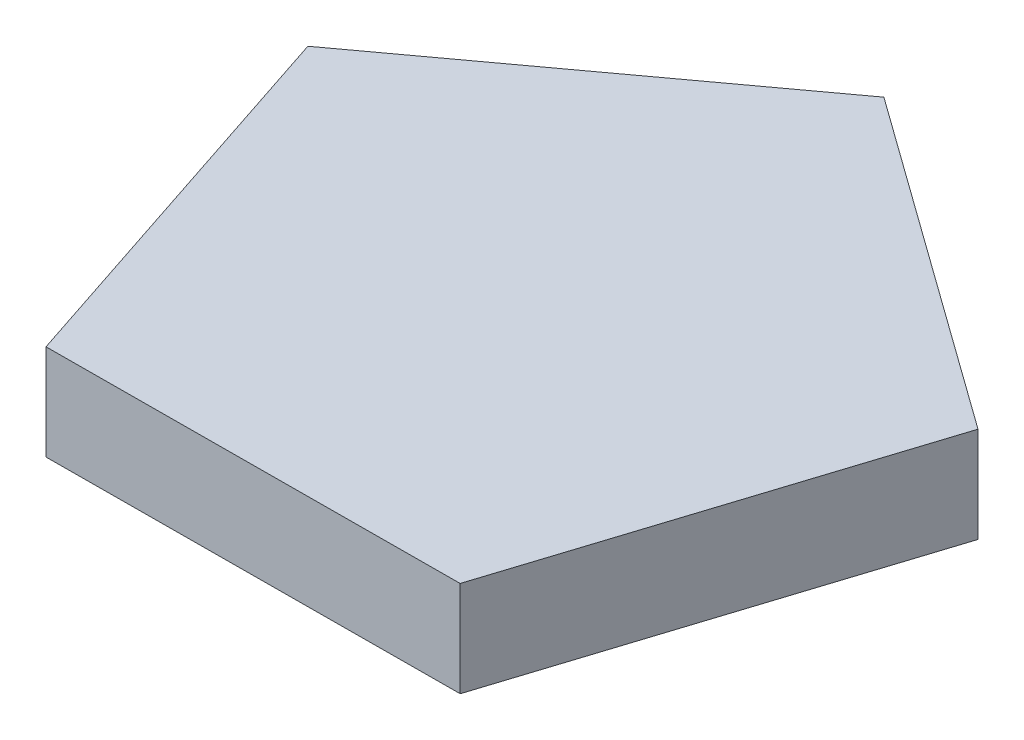
ISO-10303-21;
HEADER;
FILE_DESCRIPTION(('STEP AP214'),'2;1');
FILE_NAME('part.step','',(''),(''),'','','');
FILE_SCHEMA(('AUTOMOTIVE_DESIGN { 1 0 10303 214 1 1 1 1 }'));
ENDSEC;
DATA;
#1=APPLICATION_CONTEXT('core data for automotive mechanical design processes');
#2=APPLICATION_PROTOCOL_DEFINITION('international standard','automotive_design',2000,#1);
#3=PRODUCT_CONTEXT('',#1,'mechanical');
#4=PRODUCT('Part','Part','',(#3));
#5=PRODUCT_RELATED_PRODUCT_CATEGORY('part','',(#4));
#6=PRODUCT_DEFINITION_FORMATION('','',#4);
#7=PRODUCT_DEFINITION_CONTEXT('part definition',#1,'design');
#8=PRODUCT_DEFINITION('design','',#6,#7);
#9=PRODUCT_DEFINITION_SHAPE('','',#8);
#10=(LENGTH_UNIT() NAMED_UNIT(*) SI_UNIT(.MILLI.,.METRE.));
#11=(NAMED_UNIT(*) PLANE_ANGLE_UNIT() SI_UNIT($,.RADIAN.));
#12=(NAMED_UNIT(*) SI_UNIT($,.STERADIAN.) SOLID_ANGLE_UNIT());
#13=UNCERTAINTY_MEASURE_WITH_UNIT(LENGTH_MEASURE(1.E-05),#10,'distance_accuracy_value','');
#14=(GEOMETRIC_REPRESENTATION_CONTEXT(3) GLOBAL_UNCERTAINTY_ASSIGNED_CONTEXT((#13)) GLOBAL_UNIT_ASSIGNED_CONTEXT((#10,
#11,#12)) REPRESENTATION_CONTEXT('',''));
#15=CARTESIAN_POINT('',(0.,0.,0.));
#16=DIRECTION('',(0.,0.,1.));
#17=DIRECTION('',(1.,0.,0.));
#18=AXIS2_PLACEMENT_3D('',#15,#16,#17);
#19=CARTESIAN_POINT('',(-39.9534683706474,10.,14.2552900290625));
#20=DIRECTION('',(-0.00516467531645516,0.,-0.9999866629755));
#21=DIRECTION('',(-0.9999866629755,0.,0.00516467531645516));
#22=AXIS2_PLACEMENT_3D('',#19,#20,#21);
#23=PLANE('',#22);
#24=DIRECTION('',(0.9999866629755,0.,-0.00516467531645516));
#25=VECTOR('',#24,1.);
#26=CARTESIAN_POINT('',(-39.9534683706474,0.,14.2552900290625));
#27=LINE('',#26,#25);
#28=CARTESIAN_POINT('',(-39.9534683706474,0.,14.2552900290625));
#29=VERTEX_POINT('',#28);
#30=CARTESIAN_POINT('',(3.17402861006254,0.,14.0325475392237));
#31=VERTEX_POINT('',#30);
#32=EDGE_CURVE('E122',#29,#31,#27,.T.);
#33=ORIENTED_EDGE('',*,*,#32,.T.);
#34=DIRECTION('',(0.,-1.,0.));
#35=VECTOR('',#34,1.);
#36=CARTESIAN_POINT('',(3.17402861006254,10.,14.0325475392237));
#37=LINE('',#36,#35);
#38=CARTESIAN_POINT('',(3.17402861006254,10.,14.0325475392237));
#39=VERTEX_POINT('',#38);
#40=EDGE_CURVE('E11',#39,#31,#37,.T.);
#41=ORIENTED_EDGE('',*,*,#40,.F.);
#42=DIRECTION('',(0.9999866629755,0.,-0.00516467531645516));
#43=VECTOR('',#42,1.);
#44=CARTESIAN_POINT('',(-39.9534683706474,10.,14.2552900290625));
#45=LINE('',#44,#43);
#46=CARTESIAN_POINT('',(-39.9534683706474,10.,14.2552900290625));
#47=VERTEX_POINT('',#46);
#48=EDGE_CURVE('E135',#47,#39,#45,.T.);
#49=ORIENTED_EDGE('',*,*,#48,.F.);
#50=DIRECTION('',(0.,-1.,0.));
#51=VECTOR('',#50,1.);
#52=CARTESIAN_POINT('',(-39.9534683706474,10.,14.2552900290625));
#53=LINE('',#52,#51);
#54=EDGE_CURVE('E118',#47,#29,#53,.T.);
#55=ORIENTED_EDGE('',*,*,#54,.T.);
#56=EDGE_LOOP('',(#33,#41,#49,#55));
#57=FACE_BOUND('',#56,.T.);
#58=ADVANCED_FACE('F43',(#57),#23,.F.);
#59=CARTESIAN_POINT('',(3.17402861006254,10.,14.0325475392237));
#60=DIRECTION('',(-0.952639804474308,0.,-0.304100974893459));
#61=DIRECTION('',(-0.304100974893459,0.,0.952639804474308));
#62=AXIS2_PLACEMENT_3D('',#59,#60,#61);
#63=PLANE('',#62);
#64=DIRECTION('',(0.304100974893459,0.,-0.952639804474308));
#65=VECTOR('',#64,1.);
#66=CARTESIAN_POINT('',(3.17402861006254,0.,14.0325475392237));
#67=LINE('',#66,#65);
#68=CARTESIAN_POINT('',(16.2893174055392,0.,-27.0529707105096));
#69=VERTEX_POINT('',#68);
#70=EDGE_CURVE('E126',#31,#69,#67,.T.);
#71=ORIENTED_EDGE('',*,*,#70,.T.);
#72=DIRECTION('',(0.,-1.,0.));
#73=VECTOR('',#72,1.);
#74=CARTESIAN_POINT('',(16.2893174055392,10.,-27.0529707105096));
#75=LINE('',#74,#73);
#76=CARTESIAN_POINT('',(16.2893174055392,10.,-27.0529707105096));
#77=VERTEX_POINT('',#76);
#78=EDGE_CURVE('E52',#77,#69,#75,.T.);
#79=ORIENTED_EDGE('',*,*,#78,.F.);
#80=DIRECTION('',(0.304100974893459,0.,-0.952639804474308));
#81=VECTOR('',#80,1.);
#82=CARTESIAN_POINT('',(3.17402861006254,10.,14.0325475392237));
#83=LINE('',#82,#81);
#84=EDGE_CURVE('E94',#39,#77,#83,.T.);
#85=ORIENTED_EDGE('',*,*,#84,.F.);
#86=ORIENTED_EDGE('',*,*,#40,.T.);
#87=EDGE_LOOP('',(#71,#79,#85,#86));
#88=FACE_BOUND('',#87,.T.);
#89=ADVANCED_FACE('F157',(#88),#63,.F.);
#90=CARTESIAN_POINT('',(16.2893174055392,10.,-27.0529707105096));
#91=DIRECTION('',(-0.583599102884721,0.,0.812041924479364));
#92=DIRECTION('',(0.812041924479364,0.,0.583599102884721));
#93=AXIS2_PLACEMENT_3D('',#90,#91,#92);
#94=PLANE('',#93);
#95=DIRECTION('',(-0.812041924479364,0.,-0.583599102884721));
#96=VECTOR('',#95,1.);
#97=CARTESIAN_POINT('',(16.2893174055392,0.,-27.0529707105096));
#98=LINE('',#97,#96);
#99=CARTESIAN_POINT('',(-18.7324853272956,0.,-52.2224749444102));
#100=VERTEX_POINT('',#99);
#101=EDGE_CURVE('E110',#69,#100,#98,.T.);
#102=ORIENTED_EDGE('',*,*,#101,.T.);
#103=DIRECTION('',(0.,-1.,0.));
#104=VECTOR('',#103,1.);
#105=CARTESIAN_POINT('',(-18.7324853272956,10.,-52.2224749444102));
#106=LINE('',#105,#104);
#107=CARTESIAN_POINT('',(-18.7324853272956,10.,-52.2224749444102));
#108=VERTEX_POINT('',#107);
#109=EDGE_CURVE('E107',#108,#100,#106,.T.);
#110=ORIENTED_EDGE('',*,*,#109,.F.);
#111=DIRECTION('',(-0.812041924479364,0.,-0.583599102884721));
#112=VECTOR('',#111,1.);
#113=CARTESIAN_POINT('',(16.2893174055392,10.,-27.0529707105096));
#114=LINE('',#113,#112);
#115=EDGE_CURVE('E98',#77,#108,#114,.T.);
#116=ORIENTED_EDGE('',*,*,#115,.F.);
#117=ORIENTED_EDGE('',*,*,#78,.T.);
#118=EDGE_LOOP('',(#102,#110,#116,#117));
#119=FACE_BOUND('',#118,.T.);
#120=ADVANCED_FACE('F108',(#119),#94,.F.);
#121=CARTESIAN_POINT('',(-18.7324853272956,10.,-52.2224749444102));
#122=DIRECTION('',(0.591955723087603,0.,0.805970484511581));
#123=DIRECTION('',(0.805970484511581,0.,-0.591955723087603));
#124=AXIS2_PLACEMENT_3D('',#121,#122,#123);
#125=PLANE('',#124);
#126=DIRECTION('',(-0.805970484511581,0.,0.591955723087603));
#127=VECTOR('',#126,1.);
#128=CARTESIAN_POINT('',(-18.7324853272956,0.,-52.2224749444102));
#129=LINE('',#128,#127);
#130=CARTESIAN_POINT('',(-53.4924385589581,0.,-26.6925657912117));
#131=VERTEX_POINT('',#130);
#132=EDGE_CURVE('E80',#100,#131,#129,.T.);
#133=ORIENTED_EDGE('',*,*,#132,.T.);
#134=DIRECTION('',(0.,-1.,0.));
#135=VECTOR('',#134,1.);
#136=CARTESIAN_POINT('',(-53.4924385589581,10.,-26.6925657912117));
#137=LINE('',#136,#135);
#138=CARTESIAN_POINT('',(-53.4924385589581,10.,-26.6925657912117));
#139=VERTEX_POINT('',#138);
#140=EDGE_CURVE('E112',#139,#131,#137,.T.);
#141=ORIENTED_EDGE('',*,*,#140,.F.);
#142=DIRECTION('',(-0.805970484511581,0.,0.591955723087603));
#143=VECTOR('',#142,1.);
#144=CARTESIAN_POINT('',(-18.7324853272956,10.,-52.2224749444102));
#145=LINE('',#144,#143);
#146=EDGE_CURVE('E102',#108,#139,#145,.T.);
#147=ORIENTED_EDGE('',*,*,#146,.F.);
#148=ORIENTED_EDGE('',*,*,#109,.T.);
#149=EDGE_LOOP('',(#133,#141,#147,#148));
#150=FACE_BOUND('',#149,.T.);
#151=ADVANCED_FACE('F114',(#150),#125,.F.);
#152=CARTESIAN_POINT('',(-53.4924385589581,10.,-26.6925657912117));
#153=DIRECTION('',(0.949447859587881,0.,-0.313924771121986));
#154=DIRECTION('',(-0.313924771121986,0.,-0.949447859587881));
#155=AXIS2_PLACEMENT_3D('',#152,#153,#154);
#156=PLANE('',#155);
#157=DIRECTION('',(0.313924771121986,0.,0.949447859587881));
#158=VECTOR('',#157,1.);
#159=CARTESIAN_POINT('',(-53.4924385589581,0.,-26.6925657912117));
#160=LINE('',#159,#158);
#161=EDGE_CURVE('E86',#131,#29,#160,.T.);
#162=ORIENTED_EDGE('',*,*,#161,.T.);
#163=ORIENTED_EDGE('',*,*,#54,.F.);
#164=DIRECTION('',(0.313924771121986,0.,0.949447859587881));
#165=VECTOR('',#164,1.);
#166=CARTESIAN_POINT('',(-53.4924385589581,10.,-26.6925657912117));
#167=LINE('',#166,#165);
#168=EDGE_CURVE('E60',#139,#47,#167,.T.);
#169=ORIENTED_EDGE('',*,*,#168,.F.);
#170=ORIENTED_EDGE('',*,*,#140,.T.);
#171=EDGE_LOOP('',(#162,#163,#169,#170));
#172=FACE_BOUND('',#171,.T.);
#173=ADVANCED_FACE('F146',(#172),#156,.F.);
#174=CARTESIAN_POINT('',(0.,10.,0.));
#175=DIRECTION('',(0.,1.,0.));
#176=DIRECTION('',(0.,0.,1.));
#177=AXIS2_PLACEMENT_3D('',#174,#175,#176);
#178=PLANE('',#177);
#179=ORIENTED_EDGE('',*,*,#48,.T.);
#180=ORIENTED_EDGE('',*,*,#84,.T.);
#181=ORIENTED_EDGE('',*,*,#115,.T.);
#182=ORIENTED_EDGE('',*,*,#146,.T.);
#183=ORIENTED_EDGE('',*,*,#168,.T.);
#184=EDGE_LOOP('',(#179,#180,#181,#182,#183));
#185=FACE_BOUND('',#184,.T.);
#186=ADVANCED_FACE('F100',(#185),#178,.T.);
#187=CARTESIAN_POINT('',(0.,0.,0.));
#188=DIRECTION('',(0.,1.,0.));
#189=DIRECTION('',(0.,0.,1.));
#190=AXIS2_PLACEMENT_3D('',#187,#188,#189);
#191=PLANE('',#190);
#192=ORIENTED_EDGE('',*,*,#32,.F.);
#193=ORIENTED_EDGE('',*,*,#161,.F.);
#194=ORIENTED_EDGE('',*,*,#132,.F.);
#195=ORIENTED_EDGE('',*,*,#101,.F.);
#196=ORIENTED_EDGE('',*,*,#70,.F.);
#197=EDGE_LOOP('',(#192,#193,#194,#195,#196));
#198=FACE_BOUND('',#197,.T.);
#199=ADVANCED_FACE('F142',(#198),#191,.F.);
#200=CLOSED_SHELL('',(#58,#89,#120,#151,#173,#186,#199));
#201=MANIFOLD_SOLID_BREP('B2',#200);
#202=ADVANCED_BREP_SHAPE_REPRESENTATION('',(#18,#201),#14);
#203=SHAPE_DEFINITION_REPRESENTATION(#9,#202);
ENDSEC;
END-ISO-10303-21;
